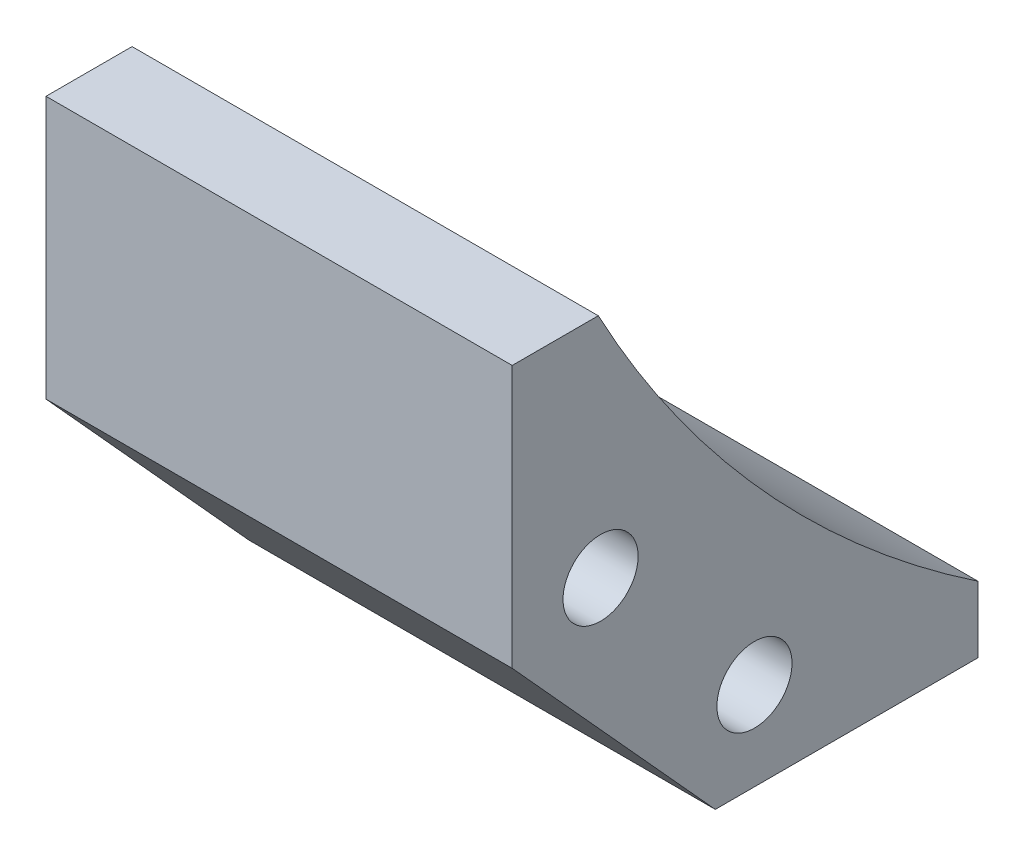
ISO-10303-21;
HEADER;
FILE_DESCRIPTION(('STEP AP214'),'2;1');
FILE_NAME('part.step','',(''),(''),'','','');
FILE_SCHEMA(('AUTOMOTIVE_DESIGN { 1 0 10303 214 1 1 1 1 }'));
ENDSEC;
DATA;
#1=APPLICATION_CONTEXT('core data for automotive mechanical design processes');
#2=APPLICATION_PROTOCOL_DEFINITION('international standard','automotive_design',2000,#1);
#3=PRODUCT_CONTEXT('',#1,'mechanical');
#4=PRODUCT('Part','Part','',(#3));
#5=PRODUCT_RELATED_PRODUCT_CATEGORY('part','',(#4));
#6=PRODUCT_DEFINITION_FORMATION('','',#4);
#7=PRODUCT_DEFINITION_CONTEXT('part definition',#1,'design');
#8=PRODUCT_DEFINITION('design','',#6,#7);
#9=PRODUCT_DEFINITION_SHAPE('','',#8);
#10=(LENGTH_UNIT() NAMED_UNIT(*) SI_UNIT(.MILLI.,.METRE.));
#11=(NAMED_UNIT(*) PLANE_ANGLE_UNIT() SI_UNIT($,.RADIAN.));
#12=(NAMED_UNIT(*) SI_UNIT($,.STERADIAN.) SOLID_ANGLE_UNIT());
#13=UNCERTAINTY_MEASURE_WITH_UNIT(LENGTH_MEASURE(1.E-05),#10,'distance_accuracy_value','');
#14=(GEOMETRIC_REPRESENTATION_CONTEXT(3) GLOBAL_UNCERTAINTY_ASSIGNED_CONTEXT((#13)) GLOBAL_UNIT_ASSIGNED_CONTEXT((#10,
#11,#12)) REPRESENTATION_CONTEXT('',''));
#15=CARTESIAN_POINT('',(0.,0.,0.));
#16=DIRECTION('',(0.,0.,1.));
#17=DIRECTION('',(1.,0.,0.));
#18=AXIS2_PLACEMENT_3D('',#15,#16,#17);
#19=CARTESIAN_POINT('',(41.0208232438831,5.,29.5465734053883));
#20=DIRECTION('',(0.,1.,0.));
#21=DIRECTION('',(0.,0.,1.));
#22=AXIS2_PLACEMENT_3D('',#19,#20,#21);
#23=PLANE('',#22);
#24=DIRECTION('',(0.,0.,-1.));
#25=VECTOR('',#24,1.);
#26=CARTESIAN_POINT('',(10.55,5.,29.5465734053883));
#27=LINE('',#26,#25);
#28=CARTESIAN_POINT('',(10.55,5.,41.4355425668018));
#29=VERTEX_POINT('',#28);
#30=CARTESIAN_POINT('',(10.55,5.,29.5465734053883));
#31=VERTEX_POINT('',#30);
#32=EDGE_CURVE('E110',#29,#31,#27,.T.);
#33=ORIENTED_EDGE('',*,*,#32,.F.);
#34=DIRECTION('',(-1.,0.,0.));
#35=VECTOR('',#34,1.);
#36=CARTESIAN_POINT('',(41.0208232438831,5.,41.4355425668018));
#37=LINE('',#36,#35);
#38=CARTESIAN_POINT('',(-10.55,5.,41.4355425668018));
#39=VERTEX_POINT('',#38);
#40=EDGE_CURVE('E58',#29,#39,#37,.T.);
#41=ORIENTED_EDGE('',*,*,#40,.T.);
#42=DIRECTION('',(0.,0.,-1.));
#43=VECTOR('',#42,1.);
#44=CARTESIAN_POINT('',(-10.55,5.,29.5465734053883));
#45=LINE('',#44,#43);
#46=CARTESIAN_POINT('',(-10.55,5.,29.5465734053883));
#47=VERTEX_POINT('',#46);
#48=EDGE_CURVE('E145',#39,#47,#45,.T.);
#49=ORIENTED_EDGE('',*,*,#48,.T.);
#50=DIRECTION('',(-1.,0.,0.));
#51=VECTOR('',#50,1.);
#52=CARTESIAN_POINT('',(41.0208232438831,5.,29.5465734053883));
#53=LINE('',#52,#51);
#54=EDGE_CURVE('E116',#31,#47,#53,.T.);
#55=ORIENTED_EDGE('',*,*,#54,.F.);
#56=EDGE_LOOP('',(#33,#41,#49,#55));
#57=FACE_BOUND('',#56,.T.);
#58=ADVANCED_FACE('F41',(#57),#23,.F.);
#59=CARTESIAN_POINT('',(41.0208232438831,5.,29.5465734053883));
#60=DIRECTION('',(0.,0.,1.));
#61=DIRECTION('',(1.,0.,0.));
#62=AXIS2_PLACEMENT_3D('',#59,#60,#61);
#63=PLANE('',#62);
#64=DIRECTION('',(0.,1.,0.));
#65=VECTOR('',#64,1.);
#66=CARTESIAN_POINT('',(10.55,5.,29.5465734053883));
#67=LINE('',#66,#65);
#68=CARTESIAN_POINT('',(10.55,8.,29.5465734053883));
#69=VERTEX_POINT('',#68);
#70=EDGE_CURVE('E108',#31,#69,#67,.T.);
#71=ORIENTED_EDGE('',*,*,#70,.F.);
#72=ORIENTED_EDGE('',*,*,#54,.T.);
#73=DIRECTION('',(0.,1.,0.));
#74=VECTOR('',#73,1.);
#75=CARTESIAN_POINT('',(-10.55,5.,29.5465734053883));
#76=LINE('',#75,#74);
#77=CARTESIAN_POINT('',(-10.55,8.,29.5465734053883));
#78=VERTEX_POINT('',#77);
#79=EDGE_CURVE('E142',#47,#78,#76,.T.);
#80=ORIENTED_EDGE('',*,*,#79,.T.);
#81=DIRECTION('',(-1.,0.,0.));
#82=VECTOR('',#81,1.);
#83=CARTESIAN_POINT('',(41.0208232438831,8.,29.5465734053883));
#84=LINE('',#83,#82);
#85=EDGE_CURVE('E103',#69,#78,#84,.T.);
#86=ORIENTED_EDGE('',*,*,#85,.F.);
#87=EDGE_LOOP('',(#71,#72,#80,#86));
#88=FACE_BOUND('',#87,.T.);
#89=ADVANCED_FACE('F167',(#88),#63,.F.);
#90=CARTESIAN_POINT('',(41.0208232438831,52.,0.));
#91=DIRECTION('',(-1.,0.,0.));
#92=DIRECTION('',(0.,0.,1.));
#93=AXIS2_PLACEMENT_3D('',#90,#91,#92);
#94=CYLINDRICAL_SURFACE('',#93,53.);
#95=CARTESIAN_POINT('',(10.55,52.,0.));
#96=DIRECTION('',(1.,0.,0.));
#97=DIRECTION('',(0.,0.,-1.));
#98=AXIS2_PLACEMENT_3D('',#95,#96,#97);
#99=CIRCLE('',#98,53.);
#100=CARTESIAN_POINT('',(10.55,27.,46.7332857821917));
#101=VERTEX_POINT('',#100);
#102=EDGE_CURVE('E94',#69,#101,#99,.F.);
#103=ORIENTED_EDGE('',*,*,#102,.F.);
#104=ORIENTED_EDGE('',*,*,#85,.T.);
#105=CARTESIAN_POINT('',(-10.55,52.,0.));
#106=DIRECTION('',(1.,0.,0.));
#107=DIRECTION('',(0.,0.,-1.));
#108=AXIS2_PLACEMENT_3D('',#105,#106,#107);
#109=CIRCLE('',#108,53.);
#110=CARTESIAN_POINT('',(-10.55,27.,46.7332857821917));
#111=VERTEX_POINT('',#110);
#112=EDGE_CURVE('E102',#78,#111,#109,.F.);
#113=ORIENTED_EDGE('',*,*,#112,.T.);
#114=DIRECTION('',(-1.,0.,0.));
#115=VECTOR('',#114,1.);
#116=CARTESIAN_POINT('',(41.0208232438831,27.,46.7332857821917));
#117=LINE('',#116,#115);
#118=EDGE_CURVE('E88',#101,#111,#117,.T.);
#119=ORIENTED_EDGE('',*,*,#118,.F.);
#120=EDGE_LOOP('',(#103,#104,#113,#119));
#121=FACE_BOUND('',#120,.T.);
#122=ADVANCED_FACE('F98',(#121),#94,.F.);
#123=CARTESIAN_POINT('',(41.0208232438831,27.,50.6290559242941));
#124=DIRECTION('',(0.,-1.,0.));
#125=DIRECTION('',(0.,0.,-1.));
#126=AXIS2_PLACEMENT_3D('',#123,#124,#125);
#127=PLANE('',#126);
#128=DIRECTION('',(0.,0.,1.));
#129=VECTOR('',#128,1.);
#130=CARTESIAN_POINT('',(10.55,27.,50.6290559242941));
#131=LINE('',#130,#129);
#132=CARTESIAN_POINT('',(10.55,27.,50.6290559242941));
#133=VERTEX_POINT('',#132);
#134=EDGE_CURVE('E50',#101,#133,#131,.T.);
#135=ORIENTED_EDGE('',*,*,#134,.F.);
#136=ORIENTED_EDGE('',*,*,#118,.T.);
#137=DIRECTION('',(0.,0.,1.));
#138=VECTOR('',#137,1.);
#139=CARTESIAN_POINT('',(-10.55,27.,50.6290559242941));
#140=LINE('',#139,#138);
#141=CARTESIAN_POINT('',(-10.55,27.,50.6290559242941));
#142=VERTEX_POINT('',#141);
#143=EDGE_CURVE('E139',#111,#142,#140,.T.);
#144=ORIENTED_EDGE('',*,*,#143,.T.);
#145=DIRECTION('',(-1.,0.,0.));
#146=VECTOR('',#145,1.);
#147=CARTESIAN_POINT('',(41.0208232438831,27.,50.6290559242941));
#148=LINE('',#147,#146);
#149=EDGE_CURVE('E91',#133,#142,#148,.T.);
#150=ORIENTED_EDGE('',*,*,#149,.F.);
#151=EDGE_LOOP('',(#135,#136,#144,#150));
#152=FACE_BOUND('',#151,.T.);
#153=ADVANCED_FACE('F85',(#152),#127,.F.);
#154=CARTESIAN_POINT('',(41.0208232438831,15.1285713410677,50.6290559242941));
#155=DIRECTION('',(0.,0.,-1.));
#156=DIRECTION('',(-1.,0.,0.));
#157=AXIS2_PLACEMENT_3D('',#154,#155,#156);
#158=PLANE('',#157);
#159=DIRECTION('',(0.,-1.,0.));
#160=VECTOR('',#159,1.);
#161=CARTESIAN_POINT('',(10.55,15.1285713410677,50.6290559242941));
#162=LINE('',#161,#160);
#163=CARTESIAN_POINT('',(10.55,15.1285713410677,50.6290559242941));
#164=VERTEX_POINT('',#163);
#165=EDGE_CURVE('E11',#133,#164,#162,.T.);
#166=ORIENTED_EDGE('',*,*,#165,.F.);
#167=ORIENTED_EDGE('',*,*,#149,.T.);
#168=DIRECTION('',(0.,-1.,0.));
#169=VECTOR('',#168,1.);
#170=CARTESIAN_POINT('',(-10.55,15.1285713410677,50.6290559242941));
#171=LINE('',#170,#169);
#172=CARTESIAN_POINT('',(-10.55,15.1285713410677,50.6290559242941));
#173=VERTEX_POINT('',#172);
#174=EDGE_CURVE('E122',#142,#173,#171,.T.);
#175=ORIENTED_EDGE('',*,*,#174,.T.);
#176=DIRECTION('',(-1.,0.,0.));
#177=VECTOR('',#176,1.);
#178=CARTESIAN_POINT('',(41.0208232438831,15.1285713410677,50.6290559242941));
#179=LINE('',#178,#177);
#180=EDGE_CURVE('E67',#164,#173,#179,.T.);
#181=ORIENTED_EDGE('',*,*,#180,.F.);
#182=EDGE_LOOP('',(#166,#167,#175,#181));
#183=FACE_BOUND('',#182,.T.);
#184=ADVANCED_FACE('F166',(#183),#158,.F.);
#185=CARTESIAN_POINT('',(41.0208232438831,5.,41.4355425668018));
#186=DIRECTION('',(0.,0.672101066025447,-0.740459422958111));
#187=DIRECTION('',(0.,0.740459422958111,0.672101066025447));
#188=AXIS2_PLACEMENT_3D('',#185,#186,#187);
#189=PLANE('',#188);
#190=DIRECTION('',(0.,-0.740459422958111,-0.672101066025447));
#191=VECTOR('',#190,1.);
#192=CARTESIAN_POINT('',(10.55,5.,41.4355425668018));
#193=LINE('',#192,#191);
#194=EDGE_CURVE('E114',#164,#29,#193,.T.);
#195=ORIENTED_EDGE('',*,*,#194,.F.);
#196=ORIENTED_EDGE('',*,*,#180,.T.);
#197=DIRECTION('',(0.,-0.740459422958111,-0.672101066025447));
#198=VECTOR('',#197,1.);
#199=CARTESIAN_POINT('',(-10.55,5.,41.4355425668018));
#200=LINE('',#199,#198);
#201=EDGE_CURVE('E130',#173,#39,#200,.T.);
#202=ORIENTED_EDGE('',*,*,#201,.T.);
#203=ORIENTED_EDGE('',*,*,#40,.F.);
#204=EDGE_LOOP('',(#195,#196,#202,#203));
#205=FACE_BOUND('',#204,.T.);
#206=ADVANCED_FACE('F150',(#205),#189,.F.);
#207=CARTESIAN_POINT('',(10.55,52.,0.));
#208=DIRECTION('',(1.,0.,0.));
#209=DIRECTION('',(0.,0.,-1.));
#210=AXIS2_PLACEMENT_3D('',#207,#208,#209);
#211=PLANE('',#210);
#212=CARTESIAN_POINT('',(10.55,16.6732234189269,46.6290559242941));
#213=DIRECTION('',(1.,0.,0.));
#214=DIRECTION('',(0.,0.,-1.));
#215=AXIS2_PLACEMENT_3D('',#212,#213,#214);
#216=CIRCLE('',#215,1.69999999999999);
#217=CARTESIAN_POINT('',(10.55,16.6732234189269,44.9290559242941));
#218=VERTEX_POINT('',#217);
#219=EDGE_CURVE('E126',#218,#218,#216,.T.);
#220=ORIENTED_EDGE('',*,*,#219,.F.);
#221=EDGE_LOOP('',(#220));
#222=FACE_BOUND('',#221,.T.);
#223=CARTESIAN_POINT('',(10.55,8.99999999999999,39.6642156105475));
#224=DIRECTION('',(1.,0.,0.));
#225=DIRECTION('',(0.,0.,-1.));
#226=AXIS2_PLACEMENT_3D('',#223,#224,#225);
#227=CIRCLE('',#226,1.69999999999999);
#228=CARTESIAN_POINT('',(10.55,8.99999999999999,37.9642156105475));
#229=VERTEX_POINT('',#228);
#230=EDGE_CURVE('E123',#229,#229,#227,.T.);
#231=ORIENTED_EDGE('',*,*,#230,.F.);
#232=EDGE_LOOP('',(#231));
#233=FACE_BOUND('',#232,.T.);
#234=ORIENTED_EDGE('',*,*,#194,.T.);
#235=ORIENTED_EDGE('',*,*,#32,.T.);
#236=ORIENTED_EDGE('',*,*,#70,.T.);
#237=ORIENTED_EDGE('',*,*,#102,.T.);
#238=ORIENTED_EDGE('',*,*,#134,.T.);
#239=ORIENTED_EDGE('',*,*,#165,.T.);
#240=EDGE_LOOP('',(#234,#235,#236,#237,#238,#239));
#241=FACE_BOUND('',#240,.T.);
#242=ADVANCED_FACE('F43',(#222,#233,#241),#211,.T.);
#243=CARTESIAN_POINT('',(-10.55,52.,0.));
#244=DIRECTION('',(-1.,0.,0.));
#245=DIRECTION('',(0.,0.,-1.));
#246=AXIS2_PLACEMENT_3D('',#243,#244,#245);
#247=PLANE('',#246);
#248=CARTESIAN_POINT('',(-10.55,16.6732234189269,46.6290559242941));
#249=DIRECTION('',(-1.,0.,0.));
#250=DIRECTION('',(0.,0.,1.));
#251=AXIS2_PLACEMENT_3D('',#248,#249,#250);
#252=CIRCLE('',#251,1.69999999999999);
#253=CARTESIAN_POINT('',(-10.55,16.6732234189269,48.329055924294));
#254=VERTEX_POINT('',#253);
#255=EDGE_CURVE('E45',#254,#254,#252,.T.);
#256=ORIENTED_EDGE('',*,*,#255,.F.);
#257=EDGE_LOOP('',(#256));
#258=FACE_BOUND('',#257,.T.);
#259=CARTESIAN_POINT('',(-10.55,8.99999999999999,39.6642156105475));
#260=DIRECTION('',(-1.,0.,0.));
#261=DIRECTION('',(0.,0.,1.));
#262=AXIS2_PLACEMENT_3D('',#259,#260,#261);
#263=CIRCLE('',#262,1.69999999999999);
#264=CARTESIAN_POINT('',(-10.55,8.99999999999999,41.3642156105475));
#265=VERTEX_POINT('',#264);
#266=EDGE_CURVE('E125',#265,#265,#263,.T.);
#267=ORIENTED_EDGE('',*,*,#266,.F.);
#268=EDGE_LOOP('',(#267));
#269=FACE_BOUND('',#268,.T.);
#270=ORIENTED_EDGE('',*,*,#201,.F.);
#271=ORIENTED_EDGE('',*,*,#174,.F.);
#272=ORIENTED_EDGE('',*,*,#143,.F.);
#273=ORIENTED_EDGE('',*,*,#112,.F.);
#274=ORIENTED_EDGE('',*,*,#79,.F.);
#275=ORIENTED_EDGE('',*,*,#48,.F.);
#276=EDGE_LOOP('',(#270,#271,#272,#273,#274,#275));
#277=FACE_BOUND('',#276,.T.);
#278=ADVANCED_FACE('F155',(#258,#269,#277),#247,.T.);
#279=CARTESIAN_POINT('',(20.55,8.99999999999999,39.6642156105475));
#280=DIRECTION('',(1.,0.,0.));
#281=DIRECTION('',(0.,0.,-1.));
#282=AXIS2_PLACEMENT_3D('',#279,#280,#281);
#283=CYLINDRICAL_SURFACE('',#282,1.69999999999999);
#284=ORIENTED_EDGE('',*,*,#266,.T.);
#285=EDGE_LOOP('',(#284));
#286=FACE_BOUND('',#285,.T.);
#287=ORIENTED_EDGE('',*,*,#230,.T.);
#288=EDGE_LOOP('',(#287));
#289=FACE_BOUND('',#288,.T.);
#290=ADVANCED_FACE('F186',(#286,#289),#283,.F.);
#291=CARTESIAN_POINT('',(20.55,16.6732234189269,46.6290559242941));
#292=DIRECTION('',(1.,0.,0.));
#293=DIRECTION('',(0.,0.,-1.));
#294=AXIS2_PLACEMENT_3D('',#291,#292,#293);
#295=CYLINDRICAL_SURFACE('',#294,1.69999999999999);
#296=ORIENTED_EDGE('',*,*,#219,.T.);
#297=EDGE_LOOP('',(#296));
#298=FACE_BOUND('',#297,.T.);
#299=ORIENTED_EDGE('',*,*,#255,.T.);
#300=EDGE_LOOP('',(#299));
#301=FACE_BOUND('',#300,.T.);
#302=ADVANCED_FACE('F190',(#298,#301),#295,.F.);
#303=CLOSED_SHELL('',(#58,#89,#122,#153,#184,#206,#242,#278,#290,#302));
#304=MANIFOLD_SOLID_BREP('B2',#303);
#305=ADVANCED_BREP_SHAPE_REPRESENTATION('',(#18,#304),#14);
#306=SHAPE_DEFINITION_REPRESENTATION(#9,#305);
ENDSEC;
END-ISO-10303-21;
